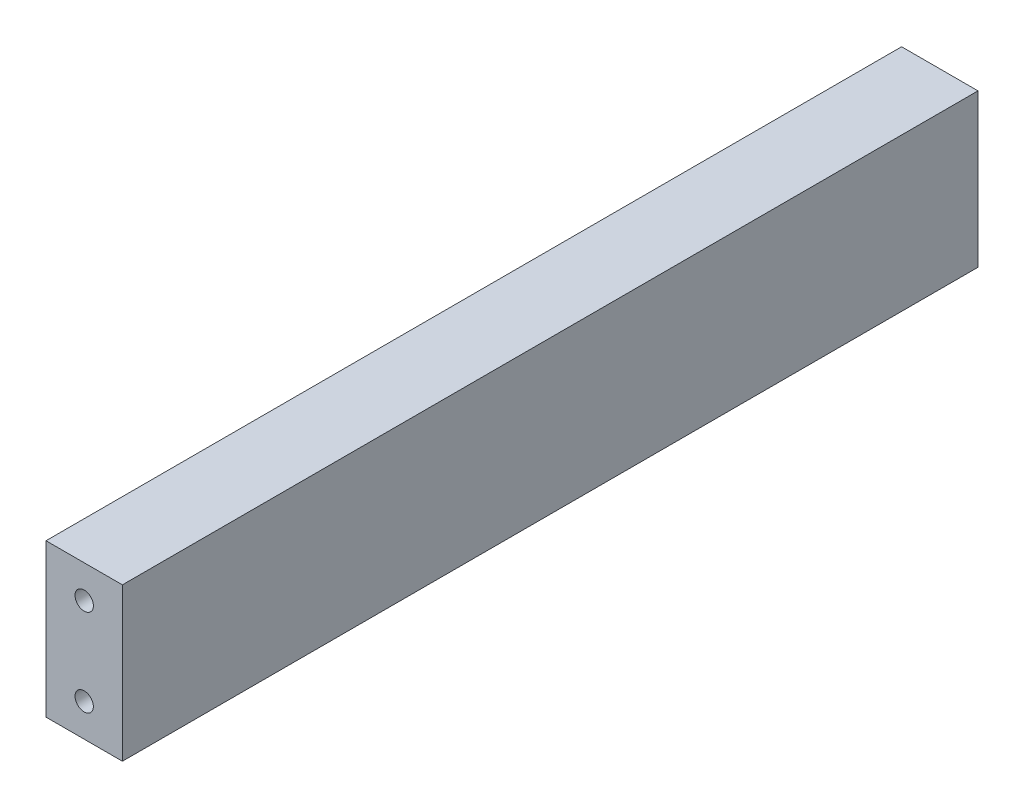
ISO-10303-21;
HEADER;
FILE_DESCRIPTION(('STEP AP214'),'2;1');
FILE_NAME('part.step','',(''),(''),'','','');
FILE_SCHEMA(('AUTOMOTIVE_DESIGN { 1 0 10303 214 1 1 1 1 }'));
ENDSEC;
DATA;
#1=APPLICATION_CONTEXT('core data for automotive mechanical design processes');
#2=APPLICATION_PROTOCOL_DEFINITION('international standard','automotive_design',2000,#1);
#3=PRODUCT_CONTEXT('',#1,'mechanical');
#4=PRODUCT('Part','Part','',(#3));
#5=PRODUCT_RELATED_PRODUCT_CATEGORY('part','',(#4));
#6=PRODUCT_DEFINITION_FORMATION('','',#4);
#7=PRODUCT_DEFINITION_CONTEXT('part definition',#1,'design');
#8=PRODUCT_DEFINITION('design','',#6,#7);
#9=PRODUCT_DEFINITION_SHAPE('','',#8);
#10=(LENGTH_UNIT() NAMED_UNIT(*) SI_UNIT(.MILLI.,.METRE.));
#11=(NAMED_UNIT(*) PLANE_ANGLE_UNIT() SI_UNIT($,.RADIAN.));
#12=(NAMED_UNIT(*) SI_UNIT($,.STERADIAN.) SOLID_ANGLE_UNIT());
#13=UNCERTAINTY_MEASURE_WITH_UNIT(LENGTH_MEASURE(1.E-05),#10,'distance_accuracy_value','');
#14=(GEOMETRIC_REPRESENTATION_CONTEXT(3) GLOBAL_UNCERTAINTY_ASSIGNED_CONTEXT((#13)) GLOBAL_UNIT_ASSIGNED_CONTEXT((#10,
#11,#12)) REPRESENTATION_CONTEXT('',''));
#15=CARTESIAN_POINT('',(0.,0.,0.));
#16=DIRECTION('',(0.,0.,1.));
#17=DIRECTION('',(1.,0.,0.));
#18=AXIS2_PLACEMENT_3D('',#15,#16,#17);
#19=CARTESIAN_POINT('',(8.75,-17.5,98.));
#20=DIRECTION('',(-1.,0.,0.));
#21=DIRECTION('',(0.,0.,1.));
#22=AXIS2_PLACEMENT_3D('',#19,#20,#21);
#23=PLANE('',#22);
#24=DIRECTION('',(0.,1.,0.));
#25=VECTOR('',#24,1.);
#26=CARTESIAN_POINT('',(8.75,-17.5,-98.));
#27=LINE('',#26,#25);
#28=CARTESIAN_POINT('',(8.75,-17.5,-98.));
#29=VERTEX_POINT('',#28);
#30=CARTESIAN_POINT('',(8.75,17.5,-98.));
#31=VERTEX_POINT('',#30);
#32=EDGE_CURVE('E106',#29,#31,#27,.T.);
#33=ORIENTED_EDGE('',*,*,#32,.T.);
#34=DIRECTION('',(0.,0.,-1.));
#35=VECTOR('',#34,1.);
#36=CARTESIAN_POINT('',(8.75,17.5,98.));
#37=LINE('',#36,#35);
#38=CARTESIAN_POINT('',(8.75,17.5,98.));
#39=VERTEX_POINT('',#38);
#40=EDGE_CURVE('E11',#39,#31,#37,.T.);
#41=ORIENTED_EDGE('',*,*,#40,.F.);
#42=DIRECTION('',(0.,1.,0.));
#43=VECTOR('',#42,1.);
#44=CARTESIAN_POINT('',(8.75,-17.5,98.));
#45=LINE('',#44,#43);
#46=CARTESIAN_POINT('',(8.75,-17.5,98.));
#47=VERTEX_POINT('',#46);
#48=EDGE_CURVE('E93',#47,#39,#45,.T.);
#49=ORIENTED_EDGE('',*,*,#48,.F.);
#50=DIRECTION('',(0.,0.,-1.));
#51=VECTOR('',#50,1.);
#52=CARTESIAN_POINT('',(8.75,-17.5,98.));
#53=LINE('',#52,#51);
#54=EDGE_CURVE('E102',#47,#29,#53,.T.);
#55=ORIENTED_EDGE('',*,*,#54,.T.);
#56=EDGE_LOOP('',(#33,#41,#49,#55));
#57=FACE_BOUND('',#56,.T.);
#58=ADVANCED_FACE('F41',(#57),#23,.F.);
#59=CARTESIAN_POINT('',(-8.75,17.5,98.));
#60=DIRECTION('',(0.,-1.,0.));
#61=DIRECTION('',(0.,0.,-1.));
#62=AXIS2_PLACEMENT_3D('',#59,#60,#61);
#63=PLANE('',#62);
#64=DIRECTION('',(-1.,0.,0.));
#65=VECTOR('',#64,1.);
#66=CARTESIAN_POINT('',(-8.75,17.5,-98.));
#67=LINE('',#66,#65);
#68=CARTESIAN_POINT('',(-8.75,17.5,-98.));
#69=VERTEX_POINT('',#68);
#70=EDGE_CURVE('E97',#31,#69,#67,.T.);
#71=ORIENTED_EDGE('',*,*,#70,.T.);
#72=DIRECTION('',(0.,0.,-1.));
#73=VECTOR('',#72,1.);
#74=CARTESIAN_POINT('',(-8.75,17.5,98.));
#75=LINE('',#74,#73);
#76=CARTESIAN_POINT('',(-8.75,17.5,98.));
#77=VERTEX_POINT('',#76);
#78=EDGE_CURVE('E50',#77,#69,#75,.T.);
#79=ORIENTED_EDGE('',*,*,#78,.F.);
#80=DIRECTION('',(-1.,0.,0.));
#81=VECTOR('',#80,1.);
#82=CARTESIAN_POINT('',(-8.75,17.5,98.));
#83=LINE('',#82,#81);
#84=EDGE_CURVE('E88',#39,#77,#83,.T.);
#85=ORIENTED_EDGE('',*,*,#84,.F.);
#86=ORIENTED_EDGE('',*,*,#40,.T.);
#87=EDGE_LOOP('',(#71,#79,#85,#86));
#88=FACE_BOUND('',#87,.T.);
#89=ADVANCED_FACE('F96',(#88),#63,.F.);
#90=CARTESIAN_POINT('',(-8.75,-17.5,98.));
#91=DIRECTION('',(1.,0.,0.));
#92=DIRECTION('',(0.,0.,-1.));
#93=AXIS2_PLACEMENT_3D('',#90,#91,#92);
#94=PLANE('',#93);
#95=DIRECTION('',(0.,-1.,0.));
#96=VECTOR('',#95,1.);
#97=CARTESIAN_POINT('',(-8.75,-17.5,-98.));
#98=LINE('',#97,#96);
#99=CARTESIAN_POINT('',(-8.75,-17.5,-98.));
#100=VERTEX_POINT('',#99);
#101=EDGE_CURVE('E75',#69,#100,#98,.T.);
#102=ORIENTED_EDGE('',*,*,#101,.T.);
#103=DIRECTION('',(0.,0.,-1.));
#104=VECTOR('',#103,1.);
#105=CARTESIAN_POINT('',(-8.75,-17.5,98.));
#106=LINE('',#105,#104);
#107=CARTESIAN_POINT('',(-8.75,-17.5,98.));
#108=VERTEX_POINT('',#107);
#109=EDGE_CURVE('E98',#108,#100,#106,.T.);
#110=ORIENTED_EDGE('',*,*,#109,.F.);
#111=DIRECTION('',(0.,-1.,0.));
#112=VECTOR('',#111,1.);
#113=CARTESIAN_POINT('',(-8.75,-17.5,98.));
#114=LINE('',#113,#112);
#115=EDGE_CURVE('E91',#77,#108,#114,.T.);
#116=ORIENTED_EDGE('',*,*,#115,.F.);
#117=ORIENTED_EDGE('',*,*,#78,.T.);
#118=EDGE_LOOP('',(#102,#110,#116,#117));
#119=FACE_BOUND('',#118,.T.);
#120=ADVANCED_FACE('F100',(#119),#94,.F.);
#121=CARTESIAN_POINT('',(-8.75,-17.5,98.));
#122=DIRECTION('',(0.,1.,0.));
#123=DIRECTION('',(0.,0.,1.));
#124=AXIS2_PLACEMENT_3D('',#121,#122,#123);
#125=PLANE('',#124);
#126=DIRECTION('',(1.,0.,0.));
#127=VECTOR('',#126,1.);
#128=CARTESIAN_POINT('',(-8.75,-17.5,-98.));
#129=LINE('',#128,#127);
#130=EDGE_CURVE('E81',#100,#29,#129,.T.);
#131=ORIENTED_EDGE('',*,*,#130,.T.);
#132=ORIENTED_EDGE('',*,*,#54,.F.);
#133=DIRECTION('',(1.,0.,0.));
#134=VECTOR('',#133,1.);
#135=CARTESIAN_POINT('',(-8.75,-17.5,98.));
#136=LINE('',#135,#134);
#137=EDGE_CURVE('E58',#108,#47,#136,.T.);
#138=ORIENTED_EDGE('',*,*,#137,.F.);
#139=ORIENTED_EDGE('',*,*,#109,.T.);
#140=EDGE_LOOP('',(#131,#132,#138,#139));
#141=FACE_BOUND('',#140,.T.);
#142=ADVANCED_FACE('F114',(#141),#125,.F.);
#143=CARTESIAN_POINT('',(0.,0.,98.));
#144=DIRECTION('',(0.,0.,-1.));
#145=DIRECTION('',(-1.,0.,0.));
#146=AXIS2_PLACEMENT_3D('',#143,#144,#145);
#147=PLANE('',#146);
#148=CARTESIAN_POINT('',(0.,10.,98.));
#149=DIRECTION('',(0.,0.,1.));
#150=DIRECTION('',(1.,0.,0.));
#151=AXIS2_PLACEMENT_3D('',#148,#149,#150);
#152=CIRCLE('',#151,2.09999999999999);
#153=CARTESIAN_POINT('',(2.09999999999999,10.,98.));
#154=VERTEX_POINT('',#153);
#155=EDGE_CURVE('E125',#154,#154,#152,.T.);
#156=ORIENTED_EDGE('',*,*,#155,.F.);
#157=EDGE_LOOP('',(#156));
#158=FACE_BOUND('',#157,.T.);
#159=CARTESIAN_POINT('',(0.,-10.,98.));
#160=DIRECTION('',(0.,0.,1.));
#161=DIRECTION('',(1.,0.,0.));
#162=AXIS2_PLACEMENT_3D('',#159,#160,#161);
#163=CIRCLE('',#162,2.09999999999999);
#164=CARTESIAN_POINT('',(2.09999999999999,-10.,98.));
#165=VERTEX_POINT('',#164);
#166=EDGE_CURVE('E122',#165,#165,#163,.T.);
#167=ORIENTED_EDGE('',*,*,#166,.F.);
#168=EDGE_LOOP('',(#167));
#169=FACE_BOUND('',#168,.T.);
#170=ORIENTED_EDGE('',*,*,#48,.T.);
#171=ORIENTED_EDGE('',*,*,#84,.T.);
#172=ORIENTED_EDGE('',*,*,#115,.T.);
#173=ORIENTED_EDGE('',*,*,#137,.T.);
#174=EDGE_LOOP('',(#170,#171,#172,#173));
#175=FACE_BOUND('',#174,.T.);
#176=ADVANCED_FACE('F89',(#158,#169,#175),#147,.F.);
#177=CARTESIAN_POINT('',(0.,0.,-98.));
#178=DIRECTION('',(0.,0.,-1.));
#179=DIRECTION('',(-1.,0.,0.));
#180=AXIS2_PLACEMENT_3D('',#177,#178,#179);
#181=PLANE('',#180);
#182=CARTESIAN_POINT('',(0.,10.,-98.));
#183=DIRECTION('',(0.,0.,-1.));
#184=DIRECTION('',(-1.,0.,0.));
#185=AXIS2_PLACEMENT_3D('',#182,#183,#184);
#186=CIRCLE('',#185,2.09999999999998);
#187=CARTESIAN_POINT('',(-2.09999999999998,10.,-98.));
#188=VERTEX_POINT('',#187);
#189=EDGE_CURVE('E44',#188,#188,#186,.T.);
#190=ORIENTED_EDGE('',*,*,#189,.F.);
#191=EDGE_LOOP('',(#190));
#192=FACE_BOUND('',#191,.T.);
#193=CARTESIAN_POINT('',(0.,-10.,-98.));
#194=DIRECTION('',(0.,0.,-1.));
#195=DIRECTION('',(-1.,0.,0.));
#196=AXIS2_PLACEMENT_3D('',#193,#194,#195);
#197=CIRCLE('',#196,2.09999999999998);
#198=CARTESIAN_POINT('',(-2.09999999999998,-10.,-98.));
#199=VERTEX_POINT('',#198);
#200=EDGE_CURVE('E109',#199,#199,#197,.T.);
#201=ORIENTED_EDGE('',*,*,#200,.F.);
#202=EDGE_LOOP('',(#201));
#203=FACE_BOUND('',#202,.T.);
#204=ORIENTED_EDGE('',*,*,#32,.F.);
#205=ORIENTED_EDGE('',*,*,#130,.F.);
#206=ORIENTED_EDGE('',*,*,#101,.F.);
#207=ORIENTED_EDGE('',*,*,#70,.F.);
#208=EDGE_LOOP('',(#204,#205,#206,#207));
#209=FACE_BOUND('',#208,.T.);
#210=ADVANCED_FACE('F117',(#192,#203,#209),#181,.T.);
#211=CARTESIAN_POINT('',(0.,-10.,98.));
#212=DIRECTION('',(0.,0.,1.));
#213=DIRECTION('',(1.,0.,0.));
#214=AXIS2_PLACEMENT_3D('',#211,#212,#213);
#215=CYLINDRICAL_SURFACE('',#214,2.09999999999998);
#216=ORIENTED_EDGE('',*,*,#200,.T.);
#217=EDGE_LOOP('',(#216));
#218=FACE_BOUND('',#217,.T.);
#219=ORIENTED_EDGE('',*,*,#166,.T.);
#220=EDGE_LOOP('',(#219));
#221=FACE_BOUND('',#220,.T.);
#222=ADVANCED_FACE('F136',(#218,#221),#215,.F.);
#223=CARTESIAN_POINT('',(0.,10.,98.));
#224=DIRECTION('',(0.,0.,1.));
#225=DIRECTION('',(1.,0.,0.));
#226=AXIS2_PLACEMENT_3D('',#223,#224,#225);
#227=CYLINDRICAL_SURFACE('',#226,2.09999999999998);
#228=ORIENTED_EDGE('',*,*,#189,.T.);
#229=EDGE_LOOP('',(#228));
#230=FACE_BOUND('',#229,.T.);
#231=ORIENTED_EDGE('',*,*,#155,.T.);
#232=EDGE_LOOP('',(#231));
#233=FACE_BOUND('',#232,.T.);
#234=ADVANCED_FACE('F132',(#230,#233),#227,.F.);
#235=CLOSED_SHELL('',(#58,#89,#120,#142,#176,#210,#222,#234));
#236=MANIFOLD_SOLID_BREP('B2',#235);
#237=ADVANCED_BREP_SHAPE_REPRESENTATION('',(#18,#236),#14);
#238=SHAPE_DEFINITION_REPRESENTATION(#9,#237);
ENDSEC;
END-ISO-10303-21;
